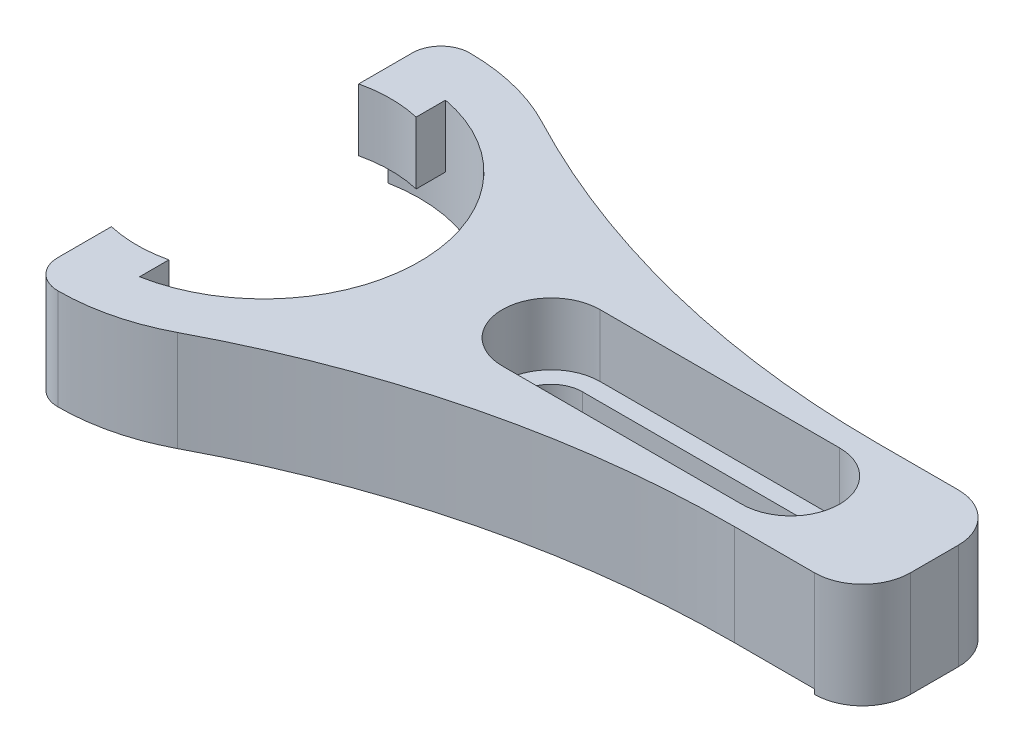
ISO-10303-21;
HEADER;
FILE_DESCRIPTION(('STEP AP214'),'2;1');
FILE_NAME('part.step','',(''),(''),'','','');
FILE_SCHEMA(('AUTOMOTIVE_DESIGN { 1 0 10303 214 1 1 1 1 }'));
ENDSEC;
DATA;
#1=APPLICATION_CONTEXT('core data for automotive mechanical design processes');
#2=APPLICATION_PROTOCOL_DEFINITION('international standard','automotive_design',2000,#1);
#3=PRODUCT_CONTEXT('',#1,'mechanical');
#4=PRODUCT('Part','Part','',(#3));
#5=PRODUCT_RELATED_PRODUCT_CATEGORY('part','',(#4));
#6=PRODUCT_DEFINITION_FORMATION('','',#4);
#7=PRODUCT_DEFINITION_CONTEXT('part definition',#1,'design');
#8=PRODUCT_DEFINITION('design','',#6,#7);
#9=PRODUCT_DEFINITION_SHAPE('','',#8);
#10=(LENGTH_UNIT() NAMED_UNIT(*) SI_UNIT(.MILLI.,.METRE.));
#11=(NAMED_UNIT(*) PLANE_ANGLE_UNIT() SI_UNIT($,.RADIAN.));
#12=(NAMED_UNIT(*) SI_UNIT($,.STERADIAN.) SOLID_ANGLE_UNIT());
#13=UNCERTAINTY_MEASURE_WITH_UNIT(LENGTH_MEASURE(1.E-05),#10,'distance_accuracy_value','');
#14=(GEOMETRIC_REPRESENTATION_CONTEXT(3) GLOBAL_UNCERTAINTY_ASSIGNED_CONTEXT((#13)) GLOBAL_UNIT_ASSIGNED_CONTEXT((#10,
#11,#12)) REPRESENTATION_CONTEXT('',''));
#15=CARTESIAN_POINT('',(0.,0.,0.));
#16=DIRECTION('',(0.,0.,1.));
#17=DIRECTION('',(1.,0.,0.));
#18=AXIS2_PLACEMENT_3D('',#15,#16,#17);
#19=CARTESIAN_POINT('',(30.,1.,0.));
#20=DIRECTION('',(0.,-1.,0.));
#21=DIRECTION('',(0.,0.,-1.));
#22=AXIS2_PLACEMENT_3D('',#19,#20,#21);
#23=PLANE('',#22);
#24=CARTESIAN_POINT('',(55.,1.,0.));
#25=DIRECTION('',(0.,1.,0.));
#26=DIRECTION('',(0.,0.,1.));
#27=AXIS2_PLACEMENT_3D('',#24,#25,#26);
#28=CIRCLE('',#27,3.25);
#29=CARTESIAN_POINT('',(55.,1.,3.25));
#30=VERTEX_POINT('',#29);
#31=CARTESIAN_POINT('',(55.,1.,-3.25));
#32=VERTEX_POINT('',#31);
#33=EDGE_CURVE('E239',#30,#32,#28,.T.);
#34=ORIENTED_EDGE('',*,*,#33,.T.);
#35=DIRECTION('',(-1.,0.,0.));
#36=VECTOR('',#35,1.);
#37=CARTESIAN_POINT('',(30.,1.,-3.25));
#38=LINE('',#37,#36);
#39=CARTESIAN_POINT('',(30.,1.,-3.25));
#40=VERTEX_POINT('',#39);
#41=EDGE_CURVE('E237',#32,#40,#38,.T.);
#42=ORIENTED_EDGE('',*,*,#41,.T.);
#43=CARTESIAN_POINT('',(30.,1.,0.));
#44=DIRECTION('',(0.,1.,0.));
#45=DIRECTION('',(0.,0.,1.));
#46=AXIS2_PLACEMENT_3D('',#43,#44,#45);
#47=CIRCLE('',#46,3.25);
#48=CARTESIAN_POINT('',(30.,1.,3.25));
#49=VERTEX_POINT('',#48);
#50=EDGE_CURVE('E19',#40,#49,#47,.T.);
#51=ORIENTED_EDGE('',*,*,#50,.T.);
#52=DIRECTION('',(1.,0.,0.));
#53=VECTOR('',#52,1.);
#54=CARTESIAN_POINT('',(30.,1.,3.25));
#55=LINE('',#54,#53);
#56=EDGE_CURVE('E260',#49,#30,#55,.T.);
#57=ORIENTED_EDGE('',*,*,#56,.T.);
#58=EDGE_LOOP('',(#34,#42,#51,#57));
#59=FACE_BOUND('',#58,.T.);
#60=CARTESIAN_POINT('',(55.,1.,0.));
#61=DIRECTION('',(0.,-1.,0.));
#62=DIRECTION('',(0.,0.,-1.));
#63=AXIS2_PLACEMENT_3D('',#60,#61,#62);
#64=CIRCLE('',#63,5.1);
#65=CARTESIAN_POINT('',(55.,1.,-5.1));
#66=VERTEX_POINT('',#65);
#67=CARTESIAN_POINT('',(55.,1.,5.1));
#68=VERTEX_POINT('',#67);
#69=EDGE_CURVE('E261',#66,#68,#64,.T.);
#70=ORIENTED_EDGE('',*,*,#69,.T.);
#71=DIRECTION('',(1.,0.,0.));
#72=VECTOR('',#71,1.);
#73=CARTESIAN_POINT('',(55.,1.,5.1));
#74=LINE('',#73,#72);
#75=CARTESIAN_POINT('',(30.,1.,5.1));
#76=VERTEX_POINT('',#75);
#77=EDGE_CURVE('E256',#68,#76,#74,.F.);
#78=ORIENTED_EDGE('',*,*,#77,.T.);
#79=CARTESIAN_POINT('',(30.,1.,0.));
#80=DIRECTION('',(0.,-1.,0.));
#81=DIRECTION('',(0.,0.,-1.));
#82=AXIS2_PLACEMENT_3D('',#79,#80,#81);
#83=CIRCLE('',#82,5.1);
#84=CARTESIAN_POINT('',(30.,1.,-5.1));
#85=VERTEX_POINT('',#84);
#86=EDGE_CURVE('E377',#76,#85,#83,.T.);
#87=ORIENTED_EDGE('',*,*,#86,.T.);
#88=DIRECTION('',(-1.,0.,0.));
#89=VECTOR('',#88,1.);
#90=CARTESIAN_POINT('',(30.,1.,-5.1));
#91=LINE('',#90,#89);
#92=EDGE_CURVE('E252',#85,#66,#91,.F.);
#93=ORIENTED_EDGE('',*,*,#92,.T.);
#94=EDGE_LOOP('',(#70,#78,#87,#93));
#95=FACE_BOUND('',#94,.T.);
#96=ADVANCED_FACE('F16',(#59,#95),#23,.T.);
#97=CARTESIAN_POINT('',(30.,0.,0.));
#98=DIRECTION('',(0.,1.,0.));
#99=DIRECTION('',(0.,0.,1.));
#100=AXIS2_PLACEMENT_3D('',#97,#98,#99);
#101=CYLINDRICAL_SURFACE('',#100,3.25);
#102=DIRECTION('',(0.,1.,0.));
#103=VECTOR('',#102,1.);
#104=CARTESIAN_POINT('',(30.,0.,-3.25));
#105=LINE('',#104,#103);
#106=CARTESIAN_POINT('',(30.,4.5,-3.25));
#107=VERTEX_POINT('',#106);
#108=EDGE_CURVE('E229',#40,#107,#105,.T.);
#109=ORIENTED_EDGE('',*,*,#108,.T.);
#110=CARTESIAN_POINT('',(30.,4.5,0.));
#111=DIRECTION('',(0.,1.,0.));
#112=DIRECTION('',(0.,0.,1.));
#113=AXIS2_PLACEMENT_3D('',#110,#111,#112);
#114=CIRCLE('',#113,3.25);
#115=CARTESIAN_POINT('',(30.,4.5,3.25));
#116=VERTEX_POINT('',#115);
#117=EDGE_CURVE('E374',#116,#107,#114,.F.);
#118=ORIENTED_EDGE('',*,*,#117,.F.);
#119=DIRECTION('',(0.,1.,0.));
#120=VECTOR('',#119,1.);
#121=CARTESIAN_POINT('',(30.,0.,3.25));
#122=LINE('',#121,#120);
#123=EDGE_CURVE('E232',#116,#49,#122,.F.);
#124=ORIENTED_EDGE('',*,*,#123,.T.);
#125=ORIENTED_EDGE('',*,*,#50,.F.);
#126=EDGE_LOOP('',(#109,#118,#124,#125));
#127=FACE_BOUND('',#126,.T.);
#128=ADVANCED_FACE('F227',(#127),#101,.F.);
#129=CARTESIAN_POINT('',(30.,0.,-3.25));
#130=DIRECTION('',(0.,0.,-1.));
#131=DIRECTION('',(-1.,0.,0.));
#132=AXIS2_PLACEMENT_3D('',#129,#130,#131);
#133=PLANE('',#132);
#134=DIRECTION('',(0.,1.,0.));
#135=VECTOR('',#134,1.);
#136=CARTESIAN_POINT('',(55.,0.,-3.25));
#137=LINE('',#136,#135);
#138=CARTESIAN_POINT('',(55.,4.5,-3.25));
#139=VERTEX_POINT('',#138);
#140=EDGE_CURVE('E242',#32,#139,#137,.T.);
#141=ORIENTED_EDGE('',*,*,#140,.T.);
#142=DIRECTION('',(1.,0.,0.));
#143=VECTOR('',#142,1.);
#144=CARTESIAN_POINT('',(30.,4.5,-3.25));
#145=LINE('',#144,#143);
#146=EDGE_CURVE('E246',#107,#139,#145,.T.);
#147=ORIENTED_EDGE('',*,*,#146,.F.);
#148=ORIENTED_EDGE('',*,*,#108,.F.);
#149=ORIENTED_EDGE('',*,*,#41,.F.);
#150=EDGE_LOOP('',(#141,#147,#148,#149));
#151=FACE_BOUND('',#150,.T.);
#152=ADVANCED_FACE('F244',(#151),#133,.F.);
#153=CARTESIAN_POINT('',(55.,0.,0.));
#154=DIRECTION('',(0.,1.,0.));
#155=DIRECTION('',(0.,0.,1.));
#156=AXIS2_PLACEMENT_3D('',#153,#154,#155);
#157=CYLINDRICAL_SURFACE('',#156,3.25);
#158=DIRECTION('',(0.,1.,0.));
#159=VECTOR('',#158,1.);
#160=CARTESIAN_POINT('',(55.,0.,3.25));
#161=LINE('',#160,#159);
#162=CARTESIAN_POINT('',(55.,4.5,3.25));
#163=VERTEX_POINT('',#162);
#164=EDGE_CURVE('E379',#30,#163,#161,.T.);
#165=ORIENTED_EDGE('',*,*,#164,.T.);
#166=CARTESIAN_POINT('',(55.,4.5,0.));
#167=DIRECTION('',(0.,1.,0.));
#168=DIRECTION('',(0.,0.,1.));
#169=AXIS2_PLACEMENT_3D('',#166,#167,#168);
#170=CIRCLE('',#169,3.25);
#171=EDGE_CURVE('E370',#139,#163,#170,.F.);
#172=ORIENTED_EDGE('',*,*,#171,.F.);
#173=ORIENTED_EDGE('',*,*,#140,.F.);
#174=ORIENTED_EDGE('',*,*,#33,.F.);
#175=EDGE_LOOP('',(#165,#172,#173,#174));
#176=FACE_BOUND('',#175,.T.);
#177=ADVANCED_FACE('F383',(#176),#157,.F.);
#178=CARTESIAN_POINT('',(30.,0.,3.25));
#179=DIRECTION('',(0.,0.,1.));
#180=DIRECTION('',(1.,0.,0.));
#181=AXIS2_PLACEMENT_3D('',#178,#179,#180);
#182=PLANE('',#181);
#183=ORIENTED_EDGE('',*,*,#123,.F.);
#184=DIRECTION('',(1.,0.,0.));
#185=VECTOR('',#184,1.);
#186=CARTESIAN_POINT('',(30.,4.5,3.25));
#187=LINE('',#186,#185);
#188=EDGE_CURVE('E373',#163,#116,#187,.F.);
#189=ORIENTED_EDGE('',*,*,#188,.F.);
#190=ORIENTED_EDGE('',*,*,#164,.F.);
#191=ORIENTED_EDGE('',*,*,#56,.F.);
#192=EDGE_LOOP('',(#183,#189,#190,#191));
#193=FACE_BOUND('',#192,.T.);
#194=ADVANCED_FACE('F667',(#193),#182,.F.);
#195=CARTESIAN_POINT('',(55.,1.,0.));
#196=DIRECTION('',(0.,-1.,0.));
#197=DIRECTION('',(0.,0.,-1.));
#198=AXIS2_PLACEMENT_3D('',#195,#196,#197);
#199=CYLINDRICAL_SURFACE('',#198,5.1);
#200=DIRECTION('',(0.,1.,0.));
#201=VECTOR('',#200,1.);
#202=CARTESIAN_POINT('',(55.,1.,5.1));
#203=LINE('',#202,#201);
#204=CARTESIAN_POINT('',(55.,0.5,5.1));
#205=VERTEX_POINT('',#204);
#206=EDGE_CURVE('E259',#205,#68,#203,.T.);
#207=ORIENTED_EDGE('',*,*,#206,.T.);
#208=ORIENTED_EDGE('',*,*,#69,.F.);
#209=DIRECTION('',(0.,1.,0.));
#210=VECTOR('',#209,1.);
#211=CARTESIAN_POINT('',(55.,1.,-5.1));
#212=LINE('',#211,#210);
#213=CARTESIAN_POINT('',(55.,0.5,-5.1));
#214=VERTEX_POINT('',#213);
#215=EDGE_CURVE('E254',#66,#214,#212,.F.);
#216=ORIENTED_EDGE('',*,*,#215,.T.);
#217=CARTESIAN_POINT('',(55.,0.5,0.));
#218=DIRECTION('',(0.,-1.,0.));
#219=DIRECTION('',(0.,0.,-1.));
#220=AXIS2_PLACEMENT_3D('',#217,#218,#219);
#221=CIRCLE('',#220,5.1);
#222=EDGE_CURVE('E367',#214,#205,#221,.T.);
#223=ORIENTED_EDGE('',*,*,#222,.T.);
#224=EDGE_LOOP('',(#207,#208,#216,#223));
#225=FACE_BOUND('',#224,.T.);
#226=ADVANCED_FACE('F413',(#225),#199,.F.);
#227=CARTESIAN_POINT('',(55.,1.,5.1));
#228=DIRECTION('',(0.,0.,1.));
#229=DIRECTION('',(1.,0.,0.));
#230=AXIS2_PLACEMENT_3D('',#227,#228,#229);
#231=PLANE('',#230);
#232=DIRECTION('',(0.,-1.,0.));
#233=VECTOR('',#232,1.);
#234=CARTESIAN_POINT('',(30.,1.,5.1));
#235=LINE('',#234,#233);
#236=CARTESIAN_POINT('',(30.,0.5,5.1));
#237=VERTEX_POINT('',#236);
#238=EDGE_CURVE('E258',#237,#76,#235,.F.);
#239=ORIENTED_EDGE('',*,*,#238,.T.);
#240=ORIENTED_EDGE('',*,*,#77,.F.);
#241=ORIENTED_EDGE('',*,*,#206,.F.);
#242=DIRECTION('',(1.,0.,0.));
#243=VECTOR('',#242,1.);
#244=CARTESIAN_POINT('',(0.,0.5,5.1));
#245=LINE('',#244,#243);
#246=EDGE_CURVE('E366',#205,#237,#245,.F.);
#247=ORIENTED_EDGE('',*,*,#246,.T.);
#248=EDGE_LOOP('',(#239,#240,#241,#247));
#249=FACE_BOUND('',#248,.T.);
#250=ADVANCED_FACE('F418',(#249),#231,.F.);
#251=CARTESIAN_POINT('',(30.,1.,0.));
#252=DIRECTION('',(0.,-1.,0.));
#253=DIRECTION('',(0.,0.,-1.));
#254=AXIS2_PLACEMENT_3D('',#251,#252,#253);
#255=CYLINDRICAL_SURFACE('',#254,5.1);
#256=DIRECTION('',(0.,1.,0.));
#257=VECTOR('',#256,1.);
#258=CARTESIAN_POINT('',(30.,1.,-5.1));
#259=LINE('',#258,#257);
#260=CARTESIAN_POINT('',(30.,0.5,-5.1));
#261=VERTEX_POINT('',#260);
#262=EDGE_CURVE('E255',#261,#85,#259,.T.);
#263=ORIENTED_EDGE('',*,*,#262,.T.);
#264=ORIENTED_EDGE('',*,*,#86,.F.);
#265=ORIENTED_EDGE('',*,*,#238,.F.);
#266=CARTESIAN_POINT('',(30.,0.5,0.));
#267=DIRECTION('',(0.,-1.,0.));
#268=DIRECTION('',(0.,0.,-1.));
#269=AXIS2_PLACEMENT_3D('',#266,#267,#268);
#270=CIRCLE('',#269,5.1);
#271=EDGE_CURVE('E363',#237,#261,#270,.T.);
#272=ORIENTED_EDGE('',*,*,#271,.T.);
#273=EDGE_LOOP('',(#263,#264,#265,#272));
#274=FACE_BOUND('',#273,.T.);
#275=ADVANCED_FACE('F659',(#274),#255,.F.);
#276=CARTESIAN_POINT('',(30.,1.,-5.1));
#277=DIRECTION('',(0.,0.,-1.));
#278=DIRECTION('',(-1.,0.,0.));
#279=AXIS2_PLACEMENT_3D('',#276,#277,#278);
#280=PLANE('',#279);
#281=ORIENTED_EDGE('',*,*,#215,.F.);
#282=ORIENTED_EDGE('',*,*,#92,.F.);
#283=ORIENTED_EDGE('',*,*,#262,.F.);
#284=DIRECTION('',(1.,0.,0.));
#285=VECTOR('',#284,1.);
#286=CARTESIAN_POINT('',(0.,0.5,-5.1));
#287=LINE('',#286,#285);
#288=EDGE_CURVE('E365',#261,#214,#287,.T.);
#289=ORIENTED_EDGE('',*,*,#288,.T.);
#290=EDGE_LOOP('',(#281,#282,#283,#289));
#291=FACE_BOUND('',#290,.T.);
#292=ADVANCED_FACE('F424',(#291),#280,.F.);
#293=CARTESIAN_POINT('',(65.,0.5,-32.5438029914271));
#294=DIRECTION('',(1.,0.,0.));
#295=DIRECTION('',(0.,0.,-1.));
#296=AXIS2_PLACEMENT_3D('',#293,#294,#295);
#297=PLANE('',#296);
#298=DIRECTION('',(0.,0.,1.));
#299=VECTOR('',#298,1.);
#300=CARTESIAN_POINT('',(65.,0.5,0.));
#301=LINE('',#300,#299);
#302=CARTESIAN_POINT('',(65.,0.5,7.5));
#303=VERTEX_POINT('',#302);
#304=CARTESIAN_POINT('',(65.,0.5,-7.5));
#305=VERTEX_POINT('',#304);
#306=EDGE_CURVE('E362',#303,#305,#301,.F.);
#307=ORIENTED_EDGE('',*,*,#306,.T.);
#308=DIRECTION('',(0.,1.,0.));
#309=VECTOR('',#308,1.);
#310=CARTESIAN_POINT('',(65.,0.5,-7.5));
#311=LINE('',#310,#309);
#312=CARTESIAN_POINT('',(65.,0.,-7.5));
#313=VERTEX_POINT('',#312);
#314=EDGE_CURVE('E396',#313,#305,#311,.T.);
#315=ORIENTED_EDGE('',*,*,#314,.F.);
#316=DIRECTION('',(0.,0.,1.));
#317=VECTOR('',#316,1.);
#318=CARTESIAN_POINT('',(65.,0.,0.));
#319=LINE('',#318,#317);
#320=CARTESIAN_POINT('',(65.,0.,7.5));
#321=VERTEX_POINT('',#320);
#322=EDGE_CURVE('E369',#313,#321,#319,.T.);
#323=ORIENTED_EDGE('',*,*,#322,.T.);
#324=DIRECTION('',(0.,1.,0.));
#325=VECTOR('',#324,1.);
#326=CARTESIAN_POINT('',(65.,0.5,7.5));
#327=LINE('',#326,#325);
#328=EDGE_CURVE('E376',#303,#321,#327,.F.);
#329=ORIENTED_EDGE('',*,*,#328,.F.);
#330=EDGE_LOOP('',(#307,#315,#323,#329));
#331=FACE_BOUND('',#330,.T.);
#332=ADVANCED_FACE('F653',(#331),#297,.F.);
#333=CARTESIAN_POINT('',(30.,4.5,0.));
#334=DIRECTION('',(0.,1.,0.));
#335=DIRECTION('',(0.,0.,1.));
#336=AXIS2_PLACEMENT_3D('',#333,#334,#335);
#337=PLANE('',#336);
#338=ORIENTED_EDGE('',*,*,#171,.T.);
#339=ORIENTED_EDGE('',*,*,#188,.T.);
#340=ORIENTED_EDGE('',*,*,#117,.T.);
#341=ORIENTED_EDGE('',*,*,#146,.T.);
#342=EDGE_LOOP('',(#338,#339,#340,#341));
#343=FACE_BOUND('',#342,.T.);
#344=CARTESIAN_POINT('',(55.,4.5,0.));
#345=DIRECTION('',(0.,1.,0.));
#346=DIRECTION('',(0.,0.,1.));
#347=AXIS2_PLACEMENT_3D('',#344,#345,#346);
#348=CIRCLE('',#347,5.1);
#349=CARTESIAN_POINT('',(55.,4.5,5.1));
#350=VERTEX_POINT('',#349);
#351=CARTESIAN_POINT('',(55.,4.5,-5.1));
#352=VERTEX_POINT('',#351);
#353=EDGE_CURVE('E355',#350,#352,#348,.T.);
#354=ORIENTED_EDGE('',*,*,#353,.T.);
#355=DIRECTION('',(-1.,0.,0.));
#356=VECTOR('',#355,1.);
#357=CARTESIAN_POINT('',(30.,4.5,-5.1));
#358=LINE('',#357,#356);
#359=CARTESIAN_POINT('',(30.,4.5,-5.1));
#360=VERTEX_POINT('',#359);
#361=EDGE_CURVE('E361',#352,#360,#358,.T.);
#362=ORIENTED_EDGE('',*,*,#361,.T.);
#363=CARTESIAN_POINT('',(30.,4.5,0.));
#364=DIRECTION('',(0.,1.,0.));
#365=DIRECTION('',(0.,0.,1.));
#366=AXIS2_PLACEMENT_3D('',#363,#364,#365);
#367=CIRCLE('',#366,5.1);
#368=CARTESIAN_POINT('',(30.,4.5,5.1));
#369=VERTEX_POINT('',#368);
#370=EDGE_CURVE('E359',#360,#369,#367,.T.);
#371=ORIENTED_EDGE('',*,*,#370,.T.);
#372=DIRECTION('',(1.,0.,0.));
#373=VECTOR('',#372,1.);
#374=CARTESIAN_POINT('',(30.,4.5,5.1));
#375=LINE('',#374,#373);
#376=EDGE_CURVE('E474',#369,#350,#375,.T.);
#377=ORIENTED_EDGE('',*,*,#376,.T.);
#378=EDGE_LOOP('',(#354,#362,#371,#377));
#379=FACE_BOUND('',#378,.T.);
#380=ADVANCED_FACE('F388',(#343,#379),#337,.T.);
#381=CARTESIAN_POINT('',(0.,4.5,0.));
#382=DIRECTION('',(0.,-1.,0.));
#383=DIRECTION('',(0.,0.,-1.));
#384=AXIS2_PLACEMENT_3D('',#381,#382,#383);
#385=PLANE('',#384);
#386=DIRECTION('',(0.,0.,1.));
#387=VECTOR('',#386,1.);
#388=CARTESIAN_POINT('',(3.,4.5,0.));
#389=LINE('',#388,#387);
#390=CARTESIAN_POINT('',(3.,4.5,-15.9706762536844));
#391=VERTEX_POINT('',#390);
#392=CARTESIAN_POINT('',(3.,4.5,-12.9059094991403));
#393=VERTEX_POINT('',#392);
#394=EDGE_CURVE('E342',#391,#393,#389,.T.);
#395=ORIENTED_EDGE('',*,*,#394,.T.);
#396=CARTESIAN_POINT('',(0.,4.5,0.));
#397=DIRECTION('',(0.,1.,0.));
#398=DIRECTION('',(0.,0.,1.));
#399=AXIS2_PLACEMENT_3D('',#396,#397,#398);
#400=CIRCLE('',#399,13.25);
#401=CARTESIAN_POINT('',(-3.,4.5,-12.9059094991403));
#402=VERTEX_POINT('',#401);
#403=EDGE_CURVE('E343',#393,#402,#400,.T.);
#404=ORIENTED_EDGE('',*,*,#403,.T.);
#405=DIRECTION('',(0.,0.,-1.));
#406=VECTOR('',#405,1.);
#407=CARTESIAN_POINT('',(-3.,4.5,-24.6391980321937));
#408=LINE('',#407,#406);
#409=CARTESIAN_POINT('',(-3.,4.5,-15.9706762536844));
#410=VERTEX_POINT('',#409);
#411=EDGE_CURVE('E467',#402,#410,#408,.T.);
#412=ORIENTED_EDGE('',*,*,#411,.T.);
#413=CARTESIAN_POINT('',(0.,4.5,0.));
#414=DIRECTION('',(0.,1.,0.));
#415=DIRECTION('',(0.,0.,1.));
#416=AXIS2_PLACEMENT_3D('',#413,#414,#415);
#417=CIRCLE('',#416,16.25);
#418=EDGE_CURVE('E340',#410,#391,#417,.F.);
#419=ORIENTED_EDGE('',*,*,#418,.T.);
#420=EDGE_LOOP('',(#395,#404,#412,#419));
#421=FACE_BOUND('',#420,.T.);
#422=ADVANCED_FACE('F646',(#421),#385,.T.);
#423=CARTESIAN_POINT('',(0.,4.5,0.));
#424=DIRECTION('',(0.,-1.,0.));
#425=DIRECTION('',(0.,0.,-1.));
#426=AXIS2_PLACEMENT_3D('',#423,#424,#425);
#427=PLANE('',#426);
#428=CARTESIAN_POINT('',(0.,4.5,0.));
#429=DIRECTION('',(0.,1.,0.));
#430=DIRECTION('',(0.,0.,1.));
#431=AXIS2_PLACEMENT_3D('',#428,#429,#430);
#432=CIRCLE('',#431,16.25);
#433=CARTESIAN_POINT('',(3.,4.5,15.9706762536844));
#434=VERTEX_POINT('',#433);
#435=CARTESIAN_POINT('',(-3.,4.5,15.9706762536844));
#436=VERTEX_POINT('',#435);
#437=EDGE_CURVE('E337',#434,#436,#432,.F.);
#438=ORIENTED_EDGE('',*,*,#437,.T.);
#439=DIRECTION('',(0.,0.,-1.));
#440=VECTOR('',#439,1.);
#441=CARTESIAN_POINT('',(-3.,4.5,-24.6391980321937));
#442=LINE('',#441,#440);
#443=CARTESIAN_POINT('',(-3.,4.5,12.9059094991403));
#444=VERTEX_POINT('',#443);
#445=EDGE_CURVE('E459',#436,#444,#442,.T.);
#446=ORIENTED_EDGE('',*,*,#445,.T.);
#447=CARTESIAN_POINT('',(0.,4.5,0.));
#448=DIRECTION('',(0.,1.,0.));
#449=DIRECTION('',(0.,0.,1.));
#450=AXIS2_PLACEMENT_3D('',#447,#448,#449);
#451=CIRCLE('',#450,13.25);
#452=CARTESIAN_POINT('',(3.,4.5,12.9059094991403));
#453=VERTEX_POINT('',#452);
#454=EDGE_CURVE('E330',#444,#453,#451,.T.);
#455=ORIENTED_EDGE('',*,*,#454,.T.);
#456=DIRECTION('',(0.,0.,1.));
#457=VECTOR('',#456,1.);
#458=CARTESIAN_POINT('',(3.,4.5,0.));
#459=LINE('',#458,#457);
#460=EDGE_CURVE('E461',#453,#434,#459,.T.);
#461=ORIENTED_EDGE('',*,*,#460,.T.);
#462=EDGE_LOOP('',(#438,#446,#455,#461));
#463=FACE_BOUND('',#462,.T.);
#464=ADVANCED_FACE('F642',(#463),#427,.T.);
#465=CARTESIAN_POINT('',(0.,0.,0.));
#466=DIRECTION('',(0.,1.,0.));
#467=DIRECTION('',(0.,0.,1.));
#468=AXIS2_PLACEMENT_3D('',#465,#466,#467);
#469=PLANE('',#468);
#470=CARTESIAN_POINT('',(65.,0.,-2.5));
#471=DIRECTION('',(0.,1.,0.));
#472=DIRECTION('',(0.,0.,1.));
#473=AXIS2_PLACEMENT_3D('',#470,#471,#472);
#474=CIRCLE('',#473,5.);
#475=CARTESIAN_POINT('',(70.,0.,-2.5));
#476=VERTEX_POINT('',#475);
#477=EDGE_CURVE('E310',#476,#313,#474,.T.);
#478=ORIENTED_EDGE('',*,*,#477,.F.);
#479=DIRECTION('',(0.,0.,-1.));
#480=VECTOR('',#479,1.);
#481=CARTESIAN_POINT('',(70.,0.,0.));
#482=LINE('',#481,#480);
#483=CARTESIAN_POINT('',(70.,0.,2.5));
#484=VERTEX_POINT('',#483);
#485=EDGE_CURVE('E318',#484,#476,#482,.T.);
#486=ORIENTED_EDGE('',*,*,#485,.F.);
#487=CARTESIAN_POINT('',(65.,0.,2.5));
#488=DIRECTION('',(0.,-1.,0.));
#489=DIRECTION('',(0.,0.,-1.));
#490=AXIS2_PLACEMENT_3D('',#487,#488,#489);
#491=CIRCLE('',#490,5.);
#492=EDGE_CURVE('E315',#321,#484,#491,.F.);
#493=ORIENTED_EDGE('',*,*,#492,.F.);
#494=ORIENTED_EDGE('',*,*,#322,.F.);
#495=EDGE_LOOP('',(#478,#486,#493,#494));
#496=FACE_BOUND('',#495,.T.);
#497=ADVANCED_FACE('F639',(#496),#469,.F.);
#498=CARTESIAN_POINT('',(0.,0.5,0.));
#499=DIRECTION('',(0.,1.,0.));
#500=DIRECTION('',(0.,0.,1.));
#501=AXIS2_PLACEMENT_3D('',#498,#499,#500);
#502=PLANE('',#501);
#503=CARTESIAN_POINT('',(0.,0.5,-18.5));
#504=DIRECTION('',(0.,-1.,0.));
#505=DIRECTION('',(0.,0.,-1.));
#506=AXIS2_PLACEMENT_3D('',#503,#504,#505);
#507=CIRCLE('',#506,3.);
#508=CARTESIAN_POINT('',(0.,0.5,-21.5));
#509=VERTEX_POINT('',#508);
#510=CARTESIAN_POINT('',(-3.,0.5,-18.5));
#511=VERTEX_POINT('',#510);
#512=EDGE_CURVE('E347',#509,#511,#507,.F.);
#513=ORIENTED_EDGE('',*,*,#512,.F.);
#514=CARTESIAN_POINT('',(0.,0.5,0.));
#515=DIRECTION('',(0.,-1.,0.));
#516=DIRECTION('',(0.,0.,-1.));
#517=AXIS2_PLACEMENT_3D('',#514,#515,#516);
#518=CIRCLE('',#517,21.5);
#519=CARTESIAN_POINT('',(10.0194513526973,0.5,-19.022633744856));
#520=VERTEX_POINT('',#519);
#521=EDGE_CURVE('E351',#520,#509,#518,.F.);
#522=ORIENTED_EDGE('',*,*,#521,.F.);
#523=CARTESIAN_POINT('',(56.6215506675682,0.5,-107.5));
#524=DIRECTION('',(0.,-1.,0.));
#525=DIRECTION('',(0.,0.,-1.));
#526=AXIS2_PLACEMENT_3D('',#523,#524,#525);
#527=CIRCLE('',#526,100.);
#528=CARTESIAN_POINT('',(56.6215506675683,0.5,-7.5));
#529=VERTEX_POINT('',#528);
#530=EDGE_CURVE('E306',#520,#529,#527,.F.);
#531=ORIENTED_EDGE('',*,*,#530,.T.);
#532=DIRECTION('',(1.,0.,0.));
#533=VECTOR('',#532,1.);
#534=CARTESIAN_POINT('',(0.,0.5,-7.49999999999998));
#535=LINE('',#534,#533);
#536=EDGE_CURVE('E313',#529,#305,#535,.T.);
#537=ORIENTED_EDGE('',*,*,#536,.T.);
#538=ORIENTED_EDGE('',*,*,#306,.F.);
#539=DIRECTION('',(1.,0.,0.));
#540=VECTOR('',#539,1.);
#541=CARTESIAN_POINT('',(0.,0.5,7.49999999999998));
#542=LINE('',#541,#540);
#543=CARTESIAN_POINT('',(56.6215506675683,0.5,7.5));
#544=VERTEX_POINT('',#543);
#545=EDGE_CURVE('E447',#544,#303,#542,.T.);
#546=ORIENTED_EDGE('',*,*,#545,.F.);
#547=CARTESIAN_POINT('',(56.6215506675682,0.5,107.5));
#548=DIRECTION('',(0.,-1.,0.));
#549=DIRECTION('',(0.,0.,-1.));
#550=AXIS2_PLACEMENT_3D('',#547,#548,#549);
#551=CIRCLE('',#550,100.);
#552=CARTESIAN_POINT('',(10.0194513526973,0.5,19.022633744856));
#553=VERTEX_POINT('',#552);
#554=EDGE_CURVE('E320',#544,#553,#551,.F.);
#555=ORIENTED_EDGE('',*,*,#554,.T.);
#556=CARTESIAN_POINT('',(0.,0.5,0.));
#557=DIRECTION('',(0.,-1.,0.));
#558=DIRECTION('',(0.,0.,-1.));
#559=AXIS2_PLACEMENT_3D('',#556,#557,#558);
#560=CIRCLE('',#559,21.5);
#561=CARTESIAN_POINT('',(0.,0.5,21.5));
#562=VERTEX_POINT('',#561);
#563=EDGE_CURVE('E323',#562,#553,#560,.F.);
#564=ORIENTED_EDGE('',*,*,#563,.F.);
#565=CARTESIAN_POINT('',(0.,0.5,18.5));
#566=DIRECTION('',(0.,-1.,0.));
#567=DIRECTION('',(0.,0.,-1.));
#568=AXIS2_PLACEMENT_3D('',#565,#566,#567);
#569=CIRCLE('',#568,3.);
#570=CARTESIAN_POINT('',(-3.,0.5,18.5));
#571=VERTEX_POINT('',#570);
#572=EDGE_CURVE('E327',#571,#562,#569,.F.);
#573=ORIENTED_EDGE('',*,*,#572,.F.);
#574=DIRECTION('',(0.,0.,-1.));
#575=VECTOR('',#574,1.);
#576=CARTESIAN_POINT('',(-3.,0.5,-24.6391980321937));
#577=LINE('',#576,#575);
#578=CARTESIAN_POINT('',(-3.,0.5,15.9706762536844));
#579=VERTEX_POINT('',#578);
#580=EDGE_CURVE('E453',#571,#579,#577,.T.);
#581=ORIENTED_EDGE('',*,*,#580,.T.);
#582=CARTESIAN_POINT('',(0.,0.5,0.));
#583=DIRECTION('',(0.,1.,0.));
#584=DIRECTION('',(0.,0.,1.));
#585=AXIS2_PLACEMENT_3D('',#582,#583,#584);
#586=CIRCLE('',#585,16.25);
#587=CARTESIAN_POINT('',(-3.,0.5,-15.9706762536844));
#588=VERTEX_POINT('',#587);
#589=EDGE_CURVE('E334',#579,#588,#586,.T.);
#590=ORIENTED_EDGE('',*,*,#589,.T.);
#591=DIRECTION('',(0.,0.,-1.));
#592=VECTOR('',#591,1.);
#593=CARTESIAN_POINT('',(-3.,0.5,-24.6391980321937));
#594=LINE('',#593,#592);
#595=EDGE_CURVE('E471',#588,#511,#594,.T.);
#596=ORIENTED_EDGE('',*,*,#595,.T.);
#597=EDGE_LOOP('',(#513,#522,#531,#537,#538,#546,#555,#564,#573,#581,#590,#596));
#598=FACE_BOUND('',#597,.T.);
#599=ORIENTED_EDGE('',*,*,#271,.F.);
#600=ORIENTED_EDGE('',*,*,#246,.F.);
#601=ORIENTED_EDGE('',*,*,#222,.F.);
#602=ORIENTED_EDGE('',*,*,#288,.F.);
#603=EDGE_LOOP('',(#599,#600,#601,#602));
#604=FACE_BOUND('',#603,.T.);
#605=ADVANCED_FACE('F430',(#598,#604),#502,.F.);
#606=CARTESIAN_POINT('',(30.,4.5,0.));
#607=DIRECTION('',(0.,1.,0.));
#608=DIRECTION('',(0.,0.,1.));
#609=AXIS2_PLACEMENT_3D('',#606,#607,#608);
#610=CYLINDRICAL_SURFACE('',#609,5.1);
#611=DIRECTION('',(0.,1.,0.));
#612=VECTOR('',#611,1.);
#613=CARTESIAN_POINT('',(30.,4.5,5.1));
#614=LINE('',#613,#612);
#615=CARTESIAN_POINT('',(30.,11.,5.1));
#616=VERTEX_POINT('',#615);
#617=EDGE_CURVE('E475',#616,#369,#614,.F.);
#618=ORIENTED_EDGE('',*,*,#617,.T.);
#619=ORIENTED_EDGE('',*,*,#370,.F.);
#620=DIRECTION('',(0.,1.,0.));
#621=VECTOR('',#620,1.);
#622=CARTESIAN_POINT('',(30.,4.5,-5.1));
#623=LINE('',#622,#621);
#624=CARTESIAN_POINT('',(30.,11.,-5.1));
#625=VERTEX_POINT('',#624);
#626=EDGE_CURVE('E358',#360,#625,#623,.T.);
#627=ORIENTED_EDGE('',*,*,#626,.T.);
#628=CARTESIAN_POINT('',(30.,11.,0.));
#629=DIRECTION('',(0.,1.,0.));
#630=DIRECTION('',(0.,0.,1.));
#631=AXIS2_PLACEMENT_3D('',#628,#629,#630);
#632=CIRCLE('',#631,5.1);
#633=EDGE_CURVE('E303',#616,#625,#632,.F.);
#634=ORIENTED_EDGE('',*,*,#633,.F.);
#635=EDGE_LOOP('',(#618,#619,#627,#634));
#636=FACE_BOUND('',#635,.T.);
#637=ADVANCED_FACE('F488',(#636),#610,.F.);
#638=CARTESIAN_POINT('',(30.,4.5,-5.1));
#639=DIRECTION('',(0.,0.,-1.));
#640=DIRECTION('',(-1.,0.,0.));
#641=AXIS2_PLACEMENT_3D('',#638,#639,#640);
#642=PLANE('',#641);
#643=ORIENTED_EDGE('',*,*,#626,.F.);
#644=ORIENTED_EDGE('',*,*,#361,.F.);
#645=DIRECTION('',(0.,1.,0.));
#646=VECTOR('',#645,1.);
#647=CARTESIAN_POINT('',(55.,4.5,-5.1));
#648=LINE('',#647,#646);
#649=CARTESIAN_POINT('',(55.,11.,-5.1));
#650=VERTEX_POINT('',#649);
#651=EDGE_CURVE('E357',#352,#650,#648,.T.);
#652=ORIENTED_EDGE('',*,*,#651,.T.);
#653=DIRECTION('',(1.,0.,0.));
#654=VECTOR('',#653,1.);
#655=CARTESIAN_POINT('',(0.,11.,-5.1));
#656=LINE('',#655,#654);
#657=EDGE_CURVE('E302',#625,#650,#656,.T.);
#658=ORIENTED_EDGE('',*,*,#657,.F.);
#659=EDGE_LOOP('',(#643,#644,#652,#658));
#660=FACE_BOUND('',#659,.T.);
#661=ADVANCED_FACE('F492',(#660),#642,.F.);
#662=CARTESIAN_POINT('',(55.,4.5,0.));
#663=DIRECTION('',(0.,1.,0.));
#664=DIRECTION('',(0.,0.,1.));
#665=AXIS2_PLACEMENT_3D('',#662,#663,#664);
#666=CYLINDRICAL_SURFACE('',#665,5.1);
#667=ORIENTED_EDGE('',*,*,#651,.F.);
#668=ORIENTED_EDGE('',*,*,#353,.F.);
#669=DIRECTION('',(0.,1.,0.));
#670=VECTOR('',#669,1.);
#671=CARTESIAN_POINT('',(55.,4.5,5.1));
#672=LINE('',#671,#670);
#673=CARTESIAN_POINT('',(55.,11.,5.1));
#674=VERTEX_POINT('',#673);
#675=EDGE_CURVE('E354',#350,#674,#672,.T.);
#676=ORIENTED_EDGE('',*,*,#675,.T.);
#677=CARTESIAN_POINT('',(55.,11.,0.));
#678=DIRECTION('',(0.,1.,0.));
#679=DIRECTION('',(0.,0.,1.));
#680=AXIS2_PLACEMENT_3D('',#677,#678,#679);
#681=CIRCLE('',#680,5.1);
#682=EDGE_CURVE('E299',#650,#674,#681,.F.);
#683=ORIENTED_EDGE('',*,*,#682,.F.);
#684=EDGE_LOOP('',(#667,#668,#676,#683));
#685=FACE_BOUND('',#684,.T.);
#686=ADVANCED_FACE('F629',(#685),#666,.F.);
#687=CARTESIAN_POINT('',(30.,4.5,5.1));
#688=DIRECTION('',(0.,0.,1.));
#689=DIRECTION('',(1.,0.,0.));
#690=AXIS2_PLACEMENT_3D('',#687,#688,#689);
#691=PLANE('',#690);
#692=ORIENTED_EDGE('',*,*,#675,.F.);
#693=ORIENTED_EDGE('',*,*,#376,.F.);
#694=ORIENTED_EDGE('',*,*,#617,.F.);
#695=DIRECTION('',(1.,0.,0.));
#696=VECTOR('',#695,1.);
#697=CARTESIAN_POINT('',(0.,11.,5.1));
#698=LINE('',#697,#696);
#699=EDGE_CURVE('E298',#674,#616,#698,.F.);
#700=ORIENTED_EDGE('',*,*,#699,.F.);
#701=EDGE_LOOP('',(#692,#693,#694,#700));
#702=FACE_BOUND('',#701,.T.);
#703=ADVANCED_FACE('F626',(#702),#691,.F.);
#704=CARTESIAN_POINT('',(0.,11.,0.));
#705=DIRECTION('',(0.,-1.,0.));
#706=DIRECTION('',(0.,0.,-1.));
#707=AXIS2_PLACEMENT_3D('',#704,#705,#706);
#708=CYLINDRICAL_SURFACE('',#707,21.5);
#709=CARTESIAN_POINT('',(0.,11.,0.));
#710=DIRECTION('',(0.,-1.,0.));
#711=DIRECTION('',(0.,0.,-1.));
#712=AXIS2_PLACEMENT_3D('',#709,#710,#711);
#713=CIRCLE('',#712,21.5);
#714=CARTESIAN_POINT('',(10.0194513526973,11.,-19.022633744856));
#715=VERTEX_POINT('',#714);
#716=CARTESIAN_POINT('',(0.,11.,-21.5));
#717=VERTEX_POINT('',#716);
#718=EDGE_CURVE('E295',#715,#717,#713,.F.);
#719=ORIENTED_EDGE('',*,*,#718,.F.);
#720=DIRECTION('',(0.,-1.,0.));
#721=VECTOR('',#720,1.);
#722=CARTESIAN_POINT('',(10.0194513526973,11.,-19.022633744856));
#723=LINE('',#722,#721);
#724=EDGE_CURVE('E309',#715,#520,#723,.T.);
#725=ORIENTED_EDGE('',*,*,#724,.T.);
#726=ORIENTED_EDGE('',*,*,#521,.T.);
#727=DIRECTION('',(0.,-1.,0.));
#728=VECTOR('',#727,1.);
#729=CARTESIAN_POINT('',(0.,11.,-21.5));
#730=LINE('',#729,#728);
#731=EDGE_CURVE('E350',#717,#509,#730,.T.);
#732=ORIENTED_EDGE('',*,*,#731,.F.);
#733=EDGE_LOOP('',(#719,#725,#726,#732));
#734=FACE_BOUND('',#733,.T.);
#735=ADVANCED_FACE('F540',(#734),#708,.T.);
#736=CARTESIAN_POINT('',(0.,11.,-18.5));
#737=DIRECTION('',(0.,-1.,0.));
#738=DIRECTION('',(0.,0.,-1.));
#739=AXIS2_PLACEMENT_3D('',#736,#737,#738);
#740=CYLINDRICAL_SURFACE('',#739,3.);
#741=CARTESIAN_POINT('',(0.,11.,-18.5));
#742=DIRECTION('',(0.,-1.,0.));
#743=DIRECTION('',(0.,0.,-1.));
#744=AXIS2_PLACEMENT_3D('',#741,#742,#743);
#745=CIRCLE('',#744,3.);
#746=CARTESIAN_POINT('',(-3.,11.,-18.5));
#747=VERTEX_POINT('',#746);
#748=EDGE_CURVE('E292',#717,#747,#745,.F.);
#749=ORIENTED_EDGE('',*,*,#748,.F.);
#750=ORIENTED_EDGE('',*,*,#731,.T.);
#751=ORIENTED_EDGE('',*,*,#512,.T.);
#752=DIRECTION('',(0.,1.,0.));
#753=VECTOR('',#752,1.);
#754=CARTESIAN_POINT('',(-3.,0.,-18.5));
#755=LINE('',#754,#753);
#756=EDGE_CURVE('E346',#511,#747,#755,.T.);
#757=ORIENTED_EDGE('',*,*,#756,.T.);
#758=EDGE_LOOP('',(#749,#750,#751,#757));
#759=FACE_BOUND('',#758,.T.);
#760=ADVANCED_FACE('F537',(#759),#740,.T.);
#761=CARTESIAN_POINT('',(-3.,0.,-24.6391980321937));
#762=DIRECTION('',(1.,0.,0.));
#763=DIRECTION('',(0.,0.,-1.));
#764=AXIS2_PLACEMENT_3D('',#761,#762,#763);
#765=PLANE('',#764);
#766=ORIENTED_EDGE('',*,*,#756,.F.);
#767=ORIENTED_EDGE('',*,*,#595,.F.);
#768=DIRECTION('',(0.,1.,0.));
#769=VECTOR('',#768,1.);
#770=CARTESIAN_POINT('',(-3.,0.,-15.9706762536844));
#771=LINE('',#770,#769);
#772=EDGE_CURVE('E470',#410,#588,#771,.F.);
#773=ORIENTED_EDGE('',*,*,#772,.F.);
#774=ORIENTED_EDGE('',*,*,#411,.F.);
#775=DIRECTION('',(0.,1.,0.));
#776=VECTOR('',#775,1.);
#777=CARTESIAN_POINT('',(-3.,-0.000999999999999265,-12.9059094991403));
#778=LINE('',#777,#776);
#779=CARTESIAN_POINT('',(-3.,11.,-12.9059094991403));
#780=VERTEX_POINT('',#779);
#781=EDGE_CURVE('E345',#402,#780,#778,.T.);
#782=ORIENTED_EDGE('',*,*,#781,.T.);
#783=DIRECTION('',(0.,0.,1.));
#784=VECTOR('',#783,1.);
#785=CARTESIAN_POINT('',(-3.,11.,0.));
#786=LINE('',#785,#784);
#787=EDGE_CURVE('E291',#747,#780,#786,.T.);
#788=ORIENTED_EDGE('',*,*,#787,.F.);
#789=EDGE_LOOP('',(#766,#767,#773,#774,#782,#788));
#790=FACE_BOUND('',#789,.T.);
#791=ADVANCED_FACE('F547',(#790),#765,.F.);
#792=CARTESIAN_POINT('',(0.,-0.000999999999999265,0.));
#793=DIRECTION('',(0.,1.,0.));
#794=DIRECTION('',(0.,0.,1.));
#795=AXIS2_PLACEMENT_3D('',#792,#793,#794);
#796=CYLINDRICAL_SURFACE('',#795,13.25);
#797=ORIENTED_EDGE('',*,*,#781,.F.);
#798=ORIENTED_EDGE('',*,*,#403,.F.);
#799=DIRECTION('',(0.,1.,0.));
#800=VECTOR('',#799,1.);
#801=CARTESIAN_POINT('',(3.,-0.000999999999999265,-12.9059094991403));
#802=LINE('',#801,#800);
#803=CARTESIAN_POINT('',(3.,11.,-12.9059094991403));
#804=VERTEX_POINT('',#803);
#805=EDGE_CURVE('E466',#393,#804,#802,.T.);
#806=ORIENTED_EDGE('',*,*,#805,.T.);
#807=CARTESIAN_POINT('',(0.,11.,0.));
#808=DIRECTION('',(0.,1.,0.));
#809=DIRECTION('',(0.,0.,1.));
#810=AXIS2_PLACEMENT_3D('',#807,#808,#809);
#811=CIRCLE('',#810,13.25);
#812=EDGE_CURVE('E288',#780,#804,#811,.F.);
#813=ORIENTED_EDGE('',*,*,#812,.F.);
#814=EDGE_LOOP('',(#797,#798,#806,#813));
#815=FACE_BOUND('',#814,.T.);
#816=ADVANCED_FACE('F615',(#815),#796,.F.);
#817=CARTESIAN_POINT('',(3.,-0.000999999999999265,0.));
#818=DIRECTION('',(-1.,0.,0.));
#819=DIRECTION('',(0.,0.,1.));
#820=AXIS2_PLACEMENT_3D('',#817,#818,#819);
#821=PLANE('',#820);
#822=DIRECTION('',(0.,1.,0.));
#823=VECTOR('',#822,1.);
#824=CARTESIAN_POINT('',(3.00000000000001,-0.000999999999999265,-15.9706762536844));
#825=LINE('',#824,#823);
#826=CARTESIAN_POINT('',(3.,11.,-15.9706762536844));
#827=VERTEX_POINT('',#826);
#828=EDGE_CURVE('E339',#391,#827,#825,.T.);
#829=ORIENTED_EDGE('',*,*,#828,.T.);
#830=DIRECTION('',(0.,0.,1.));
#831=VECTOR('',#830,1.);
#832=CARTESIAN_POINT('',(3.,11.,0.));
#833=LINE('',#832,#831);
#834=EDGE_CURVE('E287',#804,#827,#833,.F.);
#835=ORIENTED_EDGE('',*,*,#834,.F.);
#836=ORIENTED_EDGE('',*,*,#805,.F.);
#837=ORIENTED_EDGE('',*,*,#394,.F.);
#838=EDGE_LOOP('',(#829,#835,#836,#837));
#839=FACE_BOUND('',#838,.T.);
#840=ADVANCED_FACE('F611',(#839),#821,.F.);
#841=CARTESIAN_POINT('',(0.,-0.000999999999999265,0.));
#842=DIRECTION('',(0.,1.,0.));
#843=DIRECTION('',(0.,0.,1.));
#844=AXIS2_PLACEMENT_3D('',#841,#842,#843);
#845=CYLINDRICAL_SURFACE('',#844,16.25);
#846=ORIENTED_EDGE('',*,*,#589,.F.);
#847=DIRECTION('',(0.,1.,0.));
#848=VECTOR('',#847,1.);
#849=CARTESIAN_POINT('',(-3.,0.,15.9706762536844));
#850=LINE('',#849,#848);
#851=EDGE_CURVE('E332',#579,#436,#850,.T.);
#852=ORIENTED_EDGE('',*,*,#851,.T.);
#853=ORIENTED_EDGE('',*,*,#437,.F.);
#854=DIRECTION('',(0.,1.,0.));
#855=VECTOR('',#854,1.);
#856=CARTESIAN_POINT('',(3.,-0.000999999999999265,15.9706762536844));
#857=LINE('',#856,#855);
#858=CARTESIAN_POINT('',(3.,11.,15.9706762536844));
#859=VERTEX_POINT('',#858);
#860=EDGE_CURVE('E336',#434,#859,#857,.T.);
#861=ORIENTED_EDGE('',*,*,#860,.T.);
#862=CARTESIAN_POINT('',(0.,11.,0.));
#863=DIRECTION('',(0.,1.,0.));
#864=DIRECTION('',(0.,0.,1.));
#865=AXIS2_PLACEMENT_3D('',#862,#863,#864);
#866=CIRCLE('',#865,16.25);
#867=EDGE_CURVE('E284',#827,#859,#866,.F.);
#868=ORIENTED_EDGE('',*,*,#867,.F.);
#869=ORIENTED_EDGE('',*,*,#828,.F.);
#870=ORIENTED_EDGE('',*,*,#418,.F.);
#871=ORIENTED_EDGE('',*,*,#772,.T.);
#872=EDGE_LOOP('',(#846,#852,#853,#861,#868,#869,#870,#871));
#873=FACE_BOUND('',#872,.T.);
#874=ADVANCED_FACE('F607',(#873),#845,.F.);
#875=CARTESIAN_POINT('',(3.,-0.000999999999999265,0.));
#876=DIRECTION('',(-1.,0.,0.));
#877=DIRECTION('',(0.,0.,1.));
#878=AXIS2_PLACEMENT_3D('',#875,#876,#877);
#879=PLANE('',#878);
#880=DIRECTION('',(0.,1.,0.));
#881=VECTOR('',#880,1.);
#882=CARTESIAN_POINT('',(3.,-0.000999999999999265,12.9059094991403));
#883=LINE('',#882,#881);
#884=CARTESIAN_POINT('',(3.,11.,12.9059094991403));
#885=VERTEX_POINT('',#884);
#886=EDGE_CURVE('E333',#453,#885,#883,.T.);
#887=ORIENTED_EDGE('',*,*,#886,.T.);
#888=DIRECTION('',(0.,0.,1.));
#889=VECTOR('',#888,1.);
#890=CARTESIAN_POINT('',(3.,11.,0.));
#891=LINE('',#890,#889);
#892=EDGE_CURVE('E283',#859,#885,#891,.F.);
#893=ORIENTED_EDGE('',*,*,#892,.F.);
#894=ORIENTED_EDGE('',*,*,#860,.F.);
#895=ORIENTED_EDGE('',*,*,#460,.F.);
#896=EDGE_LOOP('',(#887,#893,#894,#895));
#897=FACE_BOUND('',#896,.T.);
#898=ADVANCED_FACE('F603',(#897),#879,.F.);
#899=CARTESIAN_POINT('',(0.,-0.000999999999999265,0.));
#900=DIRECTION('',(0.,1.,0.));
#901=DIRECTION('',(0.,0.,1.));
#902=AXIS2_PLACEMENT_3D('',#899,#900,#901);
#903=CYLINDRICAL_SURFACE('',#902,13.25);
#904=ORIENTED_EDGE('',*,*,#454,.F.);
#905=DIRECTION('',(0.,1.,0.));
#906=VECTOR('',#905,1.);
#907=CARTESIAN_POINT('',(-3.,0.,12.9059094991403));
#908=LINE('',#907,#906);
#909=CARTESIAN_POINT('',(-3.,11.,12.9059094991403));
#910=VERTEX_POINT('',#909);
#911=EDGE_CURVE('E456',#444,#910,#908,.T.);
#912=ORIENTED_EDGE('',*,*,#911,.T.);
#913=CARTESIAN_POINT('',(0.,11.,0.));
#914=DIRECTION('',(0.,1.,0.));
#915=DIRECTION('',(0.,0.,1.));
#916=AXIS2_PLACEMENT_3D('',#913,#914,#915);
#917=CIRCLE('',#916,13.25);
#918=EDGE_CURVE('E281',#885,#910,#917,.F.);
#919=ORIENTED_EDGE('',*,*,#918,.F.);
#920=ORIENTED_EDGE('',*,*,#886,.F.);
#921=EDGE_LOOP('',(#904,#912,#919,#920));
#922=FACE_BOUND('',#921,.T.);
#923=ADVANCED_FACE('F599',(#922),#903,.F.);
#924=CARTESIAN_POINT('',(-3.,0.,-24.6391980321937));
#925=DIRECTION('',(1.,0.,0.));
#926=DIRECTION('',(0.,0.,-1.));
#927=AXIS2_PLACEMENT_3D('',#924,#925,#926);
#928=PLANE('',#927);
#929=DIRECTION('',(0.,-1.,0.));
#930=VECTOR('',#929,1.);
#931=CARTESIAN_POINT('',(-3.,11.,18.5));
#932=LINE('',#931,#930);
#933=CARTESIAN_POINT('',(-3.,11.,18.5));
#934=VERTEX_POINT('',#933);
#935=EDGE_CURVE('E329',#934,#571,#932,.T.);
#936=ORIENTED_EDGE('',*,*,#935,.F.);
#937=DIRECTION('',(0.,0.,1.));
#938=VECTOR('',#937,1.);
#939=CARTESIAN_POINT('',(-3.,11.,0.));
#940=LINE('',#939,#938);
#941=EDGE_CURVE('E280',#910,#934,#940,.T.);
#942=ORIENTED_EDGE('',*,*,#941,.F.);
#943=ORIENTED_EDGE('',*,*,#911,.F.);
#944=ORIENTED_EDGE('',*,*,#445,.F.);
#945=ORIENTED_EDGE('',*,*,#851,.F.);
#946=ORIENTED_EDGE('',*,*,#580,.F.);
#947=EDGE_LOOP('',(#936,#942,#943,#944,#945,#946));
#948=FACE_BOUND('',#947,.T.);
#949=ADVANCED_FACE('F595',(#948),#928,.F.);
#950=CARTESIAN_POINT('',(0.,11.,18.5));
#951=DIRECTION('',(0.,-1.,0.));
#952=DIRECTION('',(0.,0.,-1.));
#953=AXIS2_PLACEMENT_3D('',#950,#951,#952);
#954=CYLINDRICAL_SURFACE('',#953,3.);
#955=ORIENTED_EDGE('',*,*,#572,.T.);
#956=DIRECTION('',(0.,-1.,0.));
#957=VECTOR('',#956,1.);
#958=CARTESIAN_POINT('',(0.,11.,21.5));
#959=LINE('',#958,#957);
#960=CARTESIAN_POINT('',(0.,11.,21.5));
#961=VERTEX_POINT('',#960);
#962=EDGE_CURVE('E326',#961,#562,#959,.T.);
#963=ORIENTED_EDGE('',*,*,#962,.F.);
#964=CARTESIAN_POINT('',(0.,11.,18.5));
#965=DIRECTION('',(0.,-1.,0.));
#966=DIRECTION('',(0.,0.,-1.));
#967=AXIS2_PLACEMENT_3D('',#964,#965,#966);
#968=CIRCLE('',#967,3.);
#969=EDGE_CURVE('E277',#934,#961,#968,.F.);
#970=ORIENTED_EDGE('',*,*,#969,.F.);
#971=ORIENTED_EDGE('',*,*,#935,.T.);
#972=EDGE_LOOP('',(#955,#963,#970,#971));
#973=FACE_BOUND('',#972,.T.);
#974=ADVANCED_FACE('F591',(#973),#954,.T.);
#975=CARTESIAN_POINT('',(0.,11.,0.));
#976=DIRECTION('',(0.,-1.,0.));
#977=DIRECTION('',(0.,0.,-1.));
#978=AXIS2_PLACEMENT_3D('',#975,#976,#977);
#979=CYLINDRICAL_SURFACE('',#978,21.5);
#980=ORIENTED_EDGE('',*,*,#563,.T.);
#981=DIRECTION('',(0.,-1.,0.));
#982=VECTOR('',#981,1.);
#983=CARTESIAN_POINT('',(10.0194513526973,11.,19.022633744856));
#984=LINE('',#983,#982);
#985=CARTESIAN_POINT('',(10.0194513526973,11.,19.022633744856));
#986=VERTEX_POINT('',#985);
#987=EDGE_CURVE('E322',#553,#986,#984,.F.);
#988=ORIENTED_EDGE('',*,*,#987,.T.);
#989=CARTESIAN_POINT('',(0.,11.,0.));
#990=DIRECTION('',(0.,-1.,0.));
#991=DIRECTION('',(0.,0.,-1.));
#992=AXIS2_PLACEMENT_3D('',#989,#990,#991);
#993=CIRCLE('',#992,21.5);
#994=EDGE_CURVE('E274',#961,#986,#993,.F.);
#995=ORIENTED_EDGE('',*,*,#994,.F.);
#996=ORIENTED_EDGE('',*,*,#962,.T.);
#997=EDGE_LOOP('',(#980,#988,#995,#996));
#998=FACE_BOUND('',#997,.T.);
#999=ADVANCED_FACE('F587',(#998),#979,.T.);
#1000=CARTESIAN_POINT('',(56.6215506675682,11.,107.5));
#1001=DIRECTION('',(0.,-1.,0.));
#1002=DIRECTION('',(0.,0.,-1.));
#1003=AXIS2_PLACEMENT_3D('',#1000,#1001,#1002);
#1004=CYLINDRICAL_SURFACE('',#1003,100.);
#1005=ORIENTED_EDGE('',*,*,#554,.F.);
#1006=DIRECTION('',(0.,1.,0.));
#1007=VECTOR('',#1006,1.);
#1008=CARTESIAN_POINT('',(56.6215506675683,11.,7.5));
#1009=LINE('',#1008,#1007);
#1010=CARTESIAN_POINT('',(56.6215506675683,11.,7.5));
#1011=VERTEX_POINT('',#1010);
#1012=EDGE_CURVE('E450',#1011,#544,#1009,.F.);
#1013=ORIENTED_EDGE('',*,*,#1012,.F.);
#1014=CARTESIAN_POINT('',(56.6215506675682,11.,107.5));
#1015=DIRECTION('',(0.,-1.,0.));
#1016=DIRECTION('',(0.,0.,-1.));
#1017=AXIS2_PLACEMENT_3D('',#1014,#1015,#1016);
#1018=CIRCLE('',#1017,100.);
#1019=EDGE_CURVE('E271',#986,#1011,#1018,.T.);
#1020=ORIENTED_EDGE('',*,*,#1019,.F.);
#1021=ORIENTED_EDGE('',*,*,#987,.F.);
#1022=EDGE_LOOP('',(#1005,#1013,#1020,#1021));
#1023=FACE_BOUND('',#1022,.T.);
#1024=ADVANCED_FACE('F583',(#1023),#1004,.F.);
#1025=CARTESIAN_POINT('',(0.,11.,7.49999999999998));
#1026=DIRECTION('',(0.,0.,1.));
#1027=DIRECTION('',(1.,0.,0.));
#1028=AXIS2_PLACEMENT_3D('',#1025,#1026,#1027);
#1029=PLANE('',#1028);
#1030=DIRECTION('',(1.,0.,0.));
#1031=VECTOR('',#1030,1.);
#1032=CARTESIAN_POINT('',(0.,11.,7.5));
#1033=LINE('',#1032,#1031);
#1034=CARTESIAN_POINT('',(65.,11.,7.5));
#1035=VERTEX_POINT('',#1034);
#1036=EDGE_CURVE('E270',#1011,#1035,#1033,.T.);
#1037=ORIENTED_EDGE('',*,*,#1036,.F.);
#1038=ORIENTED_EDGE('',*,*,#1012,.T.);
#1039=ORIENTED_EDGE('',*,*,#545,.T.);
#1040=DIRECTION('',(0.,-1.,0.));
#1041=VECTOR('',#1040,1.);
#1042=CARTESIAN_POINT('',(65.,11.,7.5));
#1043=LINE('',#1042,#1041);
#1044=EDGE_CURVE('E319',#1035,#303,#1043,.T.);
#1045=ORIENTED_EDGE('',*,*,#1044,.F.);
#1046=EDGE_LOOP('',(#1037,#1038,#1039,#1045));
#1047=FACE_BOUND('',#1046,.T.);
#1048=ADVANCED_FACE('F579',(#1047),#1029,.T.);
#1049=CARTESIAN_POINT('',(65.,11.,2.5));
#1050=DIRECTION('',(0.,-1.,0.));
#1051=DIRECTION('',(0.,0.,-1.));
#1052=AXIS2_PLACEMENT_3D('',#1049,#1050,#1051);
#1053=CYLINDRICAL_SURFACE('',#1052,5.);
#1054=DIRECTION('',(0.,1.,0.));
#1055=VECTOR('',#1054,1.);
#1056=CARTESIAN_POINT('',(70.,11.,2.5));
#1057=LINE('',#1056,#1055);
#1058=CARTESIAN_POINT('',(70.,11.,2.5));
#1059=VERTEX_POINT('',#1058);
#1060=EDGE_CURVE('E446',#1059,#484,#1057,.F.);
#1061=ORIENTED_EDGE('',*,*,#1060,.F.);
#1062=CARTESIAN_POINT('',(65.,11.,2.5));
#1063=DIRECTION('',(0.,-1.,0.));
#1064=DIRECTION('',(0.,0.,-1.));
#1065=AXIS2_PLACEMENT_3D('',#1062,#1063,#1064);
#1066=CIRCLE('',#1065,5.);
#1067=EDGE_CURVE('E267',#1035,#1059,#1066,.F.);
#1068=ORIENTED_EDGE('',*,*,#1067,.F.);
#1069=ORIENTED_EDGE('',*,*,#1044,.T.);
#1070=ORIENTED_EDGE('',*,*,#328,.T.);
#1071=ORIENTED_EDGE('',*,*,#492,.T.);
#1072=EDGE_LOOP('',(#1061,#1068,#1069,#1070,#1071));
#1073=FACE_BOUND('',#1072,.T.);
#1074=ADVANCED_FACE('F575',(#1073),#1053,.T.);
#1075=CARTESIAN_POINT('',(70.,11.,0.));
#1076=DIRECTION('',(1.,0.,0.));
#1077=DIRECTION('',(0.,0.,-1.));
#1078=AXIS2_PLACEMENT_3D('',#1075,#1076,#1077);
#1079=PLANE('',#1078);
#1080=DIRECTION('',(0.,0.,1.));
#1081=VECTOR('',#1080,1.);
#1082=CARTESIAN_POINT('',(70.,11.,0.));
#1083=LINE('',#1082,#1081);
#1084=CARTESIAN_POINT('',(70.,11.,-2.5));
#1085=VERTEX_POINT('',#1084);
#1086=EDGE_CURVE('E266',#1059,#1085,#1083,.F.);
#1087=ORIENTED_EDGE('',*,*,#1086,.F.);
#1088=ORIENTED_EDGE('',*,*,#1060,.T.);
#1089=ORIENTED_EDGE('',*,*,#485,.T.);
#1090=DIRECTION('',(0.,1.,0.));
#1091=VECTOR('',#1090,1.);
#1092=CARTESIAN_POINT('',(70.,11.,-2.5));
#1093=LINE('',#1092,#1091);
#1094=EDGE_CURVE('E314',#1085,#476,#1093,.F.);
#1095=ORIENTED_EDGE('',*,*,#1094,.F.);
#1096=EDGE_LOOP('',(#1087,#1088,#1089,#1095));
#1097=FACE_BOUND('',#1096,.T.);
#1098=ADVANCED_FACE('F571',(#1097),#1079,.T.);
#1099=CARTESIAN_POINT('',(65.,11.,-2.5));
#1100=DIRECTION('',(0.,1.,0.));
#1101=DIRECTION('',(0.,0.,1.));
#1102=AXIS2_PLACEMENT_3D('',#1099,#1100,#1101);
#1103=CYLINDRICAL_SURFACE('',#1102,5.);
#1104=ORIENTED_EDGE('',*,*,#314,.T.);
#1105=DIRECTION('',(0.,1.,0.));
#1106=VECTOR('',#1105,1.);
#1107=CARTESIAN_POINT('',(65.,11.,-7.5));
#1108=LINE('',#1107,#1106);
#1109=CARTESIAN_POINT('',(65.,11.,-7.5));
#1110=VERTEX_POINT('',#1109);
#1111=EDGE_CURVE('E436',#305,#1110,#1108,.T.);
#1112=ORIENTED_EDGE('',*,*,#1111,.T.);
#1113=CARTESIAN_POINT('',(65.,11.,-2.5));
#1114=DIRECTION('',(0.,1.,0.));
#1115=DIRECTION('',(0.,0.,1.));
#1116=AXIS2_PLACEMENT_3D('',#1113,#1114,#1115);
#1117=CIRCLE('',#1116,5.);
#1118=EDGE_CURVE('E263',#1085,#1110,#1117,.T.);
#1119=ORIENTED_EDGE('',*,*,#1118,.F.);
#1120=ORIENTED_EDGE('',*,*,#1094,.T.);
#1121=ORIENTED_EDGE('',*,*,#477,.T.);
#1122=EDGE_LOOP('',(#1104,#1112,#1119,#1120,#1121));
#1123=FACE_BOUND('',#1122,.T.);
#1124=ADVANCED_FACE('F566',(#1123),#1103,.T.);
#1125=CARTESIAN_POINT('',(0.,11.,-7.49999999999998));
#1126=DIRECTION('',(0.,0.,1.));
#1127=DIRECTION('',(1.,0.,0.));
#1128=AXIS2_PLACEMENT_3D('',#1125,#1126,#1127);
#1129=PLANE('',#1128);
#1130=ORIENTED_EDGE('',*,*,#1111,.F.);
#1131=ORIENTED_EDGE('',*,*,#536,.F.);
#1132=DIRECTION('',(0.,-1.,0.));
#1133=VECTOR('',#1132,1.);
#1134=CARTESIAN_POINT('',(56.6215506675683,11.,-7.50000000000001));
#1135=LINE('',#1134,#1133);
#1136=CARTESIAN_POINT('',(56.6215506675683,11.,-7.50000000000001));
#1137=VERTEX_POINT('',#1136);
#1138=EDGE_CURVE('E34',#529,#1137,#1135,.F.);
#1139=ORIENTED_EDGE('',*,*,#1138,.T.);
#1140=DIRECTION('',(1.,0.,0.));
#1141=VECTOR('',#1140,1.);
#1142=CARTESIAN_POINT('',(0.,11.,-7.5));
#1143=LINE('',#1142,#1141);
#1144=EDGE_CURVE('E25',#1110,#1137,#1143,.F.);
#1145=ORIENTED_EDGE('',*,*,#1144,.F.);
#1146=EDGE_LOOP('',(#1130,#1131,#1139,#1145));
#1147=FACE_BOUND('',#1146,.T.);
#1148=ADVANCED_FACE('F558',(#1147),#1129,.F.);
#1149=CARTESIAN_POINT('',(56.6215506675682,11.,-107.5));
#1150=DIRECTION('',(0.,-1.,0.));
#1151=DIRECTION('',(0.,0.,-1.));
#1152=AXIS2_PLACEMENT_3D('',#1149,#1150,#1151);
#1153=CYLINDRICAL_SURFACE('',#1152,100.);
#1154=ORIENTED_EDGE('',*,*,#724,.F.);
#1155=CARTESIAN_POINT('',(56.6215506675682,11.,-107.5));
#1156=DIRECTION('',(0.,-1.,0.));
#1157=DIRECTION('',(0.,0.,-1.));
#1158=AXIS2_PLACEMENT_3D('',#1155,#1156,#1157);
#1159=CIRCLE('',#1158,100.);
#1160=EDGE_CURVE('E11',#1137,#715,#1159,.T.);
#1161=ORIENTED_EDGE('',*,*,#1160,.F.);
#1162=ORIENTED_EDGE('',*,*,#1138,.F.);
#1163=ORIENTED_EDGE('',*,*,#530,.F.);
#1164=EDGE_LOOP('',(#1154,#1161,#1162,#1163));
#1165=FACE_BOUND('',#1164,.T.);
#1166=ADVANCED_FACE('F556',(#1165),#1153,.F.);
#1167=CARTESIAN_POINT('',(0.,11.,0.));
#1168=DIRECTION('',(0.,1.,0.));
#1169=DIRECTION('',(0.,0.,1.));
#1170=AXIS2_PLACEMENT_3D('',#1167,#1168,#1169);
#1171=PLANE('',#1170);
#1172=ORIENTED_EDGE('',*,*,#1144,.T.);
#1173=ORIENTED_EDGE('',*,*,#1160,.T.);
#1174=ORIENTED_EDGE('',*,*,#718,.T.);
#1175=ORIENTED_EDGE('',*,*,#748,.T.);
#1176=ORIENTED_EDGE('',*,*,#787,.T.);
#1177=ORIENTED_EDGE('',*,*,#812,.T.);
#1178=ORIENTED_EDGE('',*,*,#834,.T.);
#1179=ORIENTED_EDGE('',*,*,#867,.T.);
#1180=ORIENTED_EDGE('',*,*,#892,.T.);
#1181=ORIENTED_EDGE('',*,*,#918,.T.);
#1182=ORIENTED_EDGE('',*,*,#941,.T.);
#1183=ORIENTED_EDGE('',*,*,#969,.T.);
#1184=ORIENTED_EDGE('',*,*,#994,.T.);
#1185=ORIENTED_EDGE('',*,*,#1019,.T.);
#1186=ORIENTED_EDGE('',*,*,#1036,.T.);
#1187=ORIENTED_EDGE('',*,*,#1067,.T.);
#1188=ORIENTED_EDGE('',*,*,#1086,.T.);
#1189=ORIENTED_EDGE('',*,*,#1118,.T.);
#1190=EDGE_LOOP('',(#1172,#1173,#1174,#1175,#1176,#1177,#1178,#1179,#1180,#1181,#1182,#1183,
#1184,#1185,#1186,#1187,#1188,#1189));
#1191=FACE_BOUND('',#1190,.T.);
#1192=ORIENTED_EDGE('',*,*,#682,.T.);
#1193=ORIENTED_EDGE('',*,*,#699,.T.);
#1194=ORIENTED_EDGE('',*,*,#633,.T.);
#1195=ORIENTED_EDGE('',*,*,#657,.T.);
#1196=EDGE_LOOP('',(#1192,#1193,#1194,#1195));
#1197=FACE_BOUND('',#1196,.T.);
#1198=ADVANCED_FACE('F498',(#1191,#1197),#1171,.T.);
#1199=CLOSED_SHELL('',(#96,#128,#152,#177,#194,#226,#250,#275,#292,#332,#380,#422,#464,#497,
#605,#637,#661,#686,#703,#735,#760,#791,#816,#840,#874,#898,#923,#949,#974,#999,#1024,#1048,
#1074,#1098,#1124,#1148,#1166,#1198));
#1200=MANIFOLD_SOLID_BREP('B1',#1199);
#1201=ADVANCED_BREP_SHAPE_REPRESENTATION('',(#18,#1200),#14);
#1202=SHAPE_DEFINITION_REPRESENTATION(#9,#1201);
ENDSEC;
END-ISO-10303-21;
